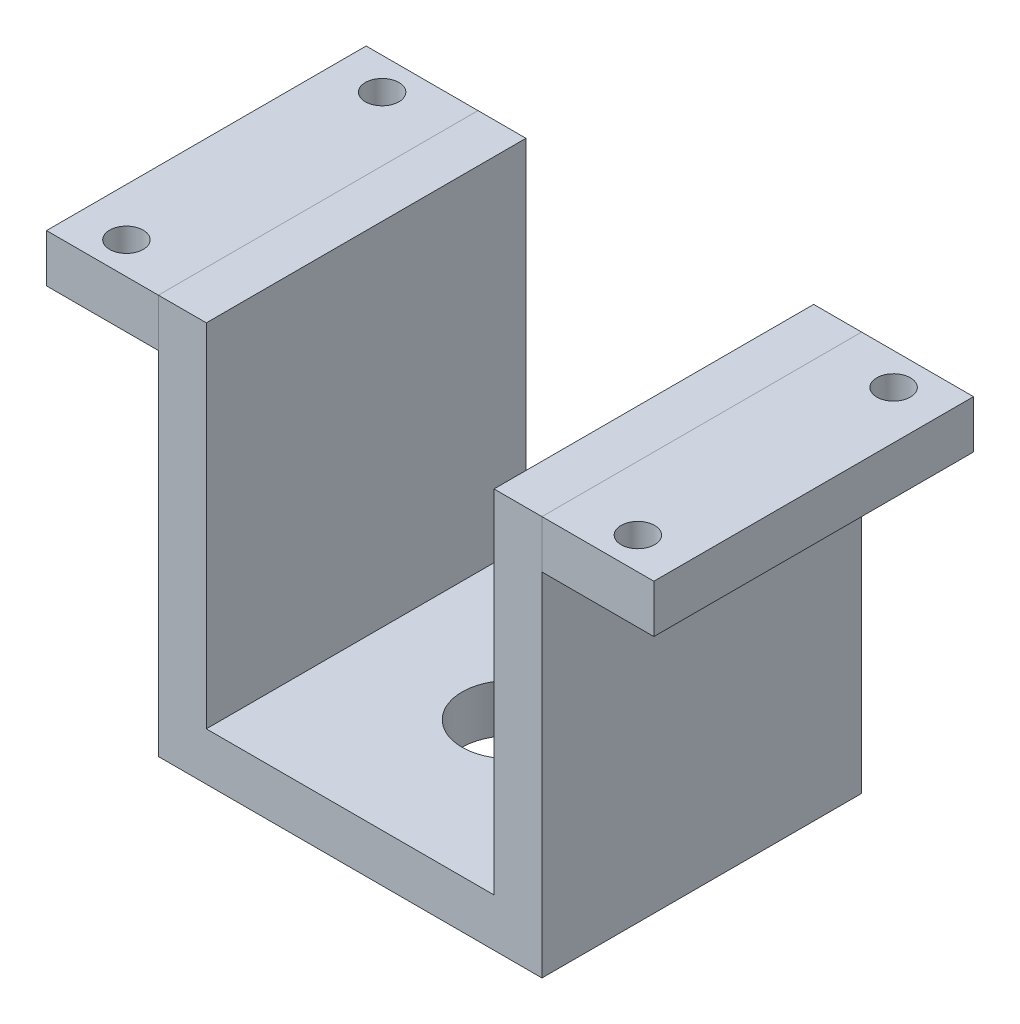
ISO-10303-21;
HEADER;
FILE_DESCRIPTION(('STEP AP214'),'2;1');
FILE_NAME('part.step','',(''),(''),'','','');
FILE_SCHEMA(('AUTOMOTIVE_DESIGN { 1 0 10303 214 1 1 1 1 }'));
ENDSEC;
DATA;
#1=APPLICATION_CONTEXT('core data for automotive mechanical design processes');
#2=APPLICATION_PROTOCOL_DEFINITION('international standard','automotive_design',2000,#1);
#3=PRODUCT_CONTEXT('',#1,'mechanical');
#4=PRODUCT('Part','Part','',(#3));
#5=PRODUCT_RELATED_PRODUCT_CATEGORY('part','',(#4));
#6=PRODUCT_DEFINITION_FORMATION('','',#4);
#7=PRODUCT_DEFINITION_CONTEXT('part definition',#1,'design');
#8=PRODUCT_DEFINITION('design','',#6,#7);
#9=PRODUCT_DEFINITION_SHAPE('','',#8);
#10=(LENGTH_UNIT() NAMED_UNIT(*) SI_UNIT(.MILLI.,.METRE.));
#11=(NAMED_UNIT(*) PLANE_ANGLE_UNIT() SI_UNIT($,.RADIAN.));
#12=(NAMED_UNIT(*) SI_UNIT($,.STERADIAN.) SOLID_ANGLE_UNIT());
#13=UNCERTAINTY_MEASURE_WITH_UNIT(LENGTH_MEASURE(1.E-05),#10,'distance_accuracy_value','');
#14=(GEOMETRIC_REPRESENTATION_CONTEXT(3) GLOBAL_UNCERTAINTY_ASSIGNED_CONTEXT((#13)) GLOBAL_UNIT_ASSIGNED_CONTEXT((#10,
#11,#12)) REPRESENTATION_CONTEXT('',''));
#15=CARTESIAN_POINT('',(0.,0.,0.));
#16=DIRECTION('',(0.,0.,1.));
#17=DIRECTION('',(1.,0.,0.));
#18=AXIS2_PLACEMENT_3D('',#15,#16,#17);
#19=CARTESIAN_POINT('',(11.9999999999999,22.,-10.));
#20=DIRECTION('',(-1.,0.,0.));
#21=DIRECTION('',(0.,0.,1.));
#22=AXIS2_PLACEMENT_3D('',#19,#20,#21);
#23=PLANE('',#22);
#24=DIRECTION('',(0.,0.,1.));
#25=VECTOR('',#24,1.);
#26=CARTESIAN_POINT('',(11.9999999999999,25.,-10.));
#27=LINE('',#26,#25);
#28=CARTESIAN_POINT('',(11.9999999999999,25.,-10.));
#29=VERTEX_POINT('',#28);
#30=CARTESIAN_POINT('',(12.0000000000001,25.,10.));
#31=VERTEX_POINT('',#30);
#32=EDGE_CURVE('E122',#29,#31,#27,.T.);
#33=ORIENTED_EDGE('',*,*,#32,.F.);
#34=DIRECTION('',(0.,1.,0.));
#35=VECTOR('',#34,1.);
#36=CARTESIAN_POINT('',(11.9999999999999,22.,-10.));
#37=LINE('',#36,#35);
#38=CARTESIAN_POINT('',(11.9999999999999,22.,-10.));
#39=VERTEX_POINT('',#38);
#40=EDGE_CURVE('E12',#39,#29,#37,.T.);
#41=ORIENTED_EDGE('',*,*,#40,.F.);
#42=DIRECTION('',(0.,0.,1.));
#43=VECTOR('',#42,1.);
#44=CARTESIAN_POINT('',(11.9999999999999,22.,-10.));
#45=LINE('',#44,#43);
#46=CARTESIAN_POINT('',(12.0000000000001,22.,10.));
#47=VERTEX_POINT('',#46);
#48=EDGE_CURVE('E112',#39,#47,#45,.T.);
#49=ORIENTED_EDGE('',*,*,#48,.T.);
#50=DIRECTION('',(0.,1.,0.));
#51=VECTOR('',#50,1.);
#52=CARTESIAN_POINT('',(12.0000000000001,22.,10.));
#53=LINE('',#52,#51);
#54=EDGE_CURVE('E53',#47,#31,#53,.T.);
#55=ORIENTED_EDGE('',*,*,#54,.T.);
#56=EDGE_LOOP('',(#33,#41,#49,#55));
#57=FACE_BOUND('',#56,.T.);
#58=ADVANCED_FACE('F50',(#57),#23,.T.);
#59=CARTESIAN_POINT('',(11.9999999999999,22.,-10.));
#60=DIRECTION('',(0.,0.,-1.));
#61=DIRECTION('',(-1.,0.,0.));
#62=AXIS2_PLACEMENT_3D('',#59,#60,#61);
#63=PLANE('',#62);
#64=DIRECTION('',(-1.,0.,0.));
#65=VECTOR('',#64,1.);
#66=CARTESIAN_POINT('',(11.9999999999999,25.,-10.));
#67=LINE('',#66,#65);
#68=CARTESIAN_POINT('',(19.,25.,-10.));
#69=VERTEX_POINT('',#68);
#70=EDGE_CURVE('E116',#69,#29,#67,.T.);
#71=ORIENTED_EDGE('',*,*,#70,.F.);
#72=DIRECTION('',(0.,1.,0.));
#73=VECTOR('',#72,1.);
#74=CARTESIAN_POINT('',(19.,22.,-10.));
#75=LINE('',#74,#73);
#76=CARTESIAN_POINT('',(19.,22.,-10.));
#77=VERTEX_POINT('',#76);
#78=EDGE_CURVE('E60',#77,#69,#75,.T.);
#79=ORIENTED_EDGE('',*,*,#78,.F.);
#80=DIRECTION('',(-1.,0.,0.));
#81=VECTOR('',#80,1.);
#82=CARTESIAN_POINT('',(11.9999999999999,22.,-10.));
#83=LINE('',#82,#81);
#84=EDGE_CURVE('E107',#77,#39,#83,.T.);
#85=ORIENTED_EDGE('',*,*,#84,.T.);
#86=ORIENTED_EDGE('',*,*,#40,.T.);
#87=EDGE_LOOP('',(#71,#79,#85,#86));
#88=FACE_BOUND('',#87,.T.);
#89=ADVANCED_FACE('F139',(#88),#63,.T.);
#90=CARTESIAN_POINT('',(19.,22.,-10.));
#91=DIRECTION('',(1.,0.,0.));
#92=DIRECTION('',(0.,0.,-1.));
#93=AXIS2_PLACEMENT_3D('',#90,#91,#92);
#94=PLANE('',#93);
#95=DIRECTION('',(0.,0.,-1.));
#96=VECTOR('',#95,1.);
#97=CARTESIAN_POINT('',(19.,25.,-10.));
#98=LINE('',#97,#96);
#99=CARTESIAN_POINT('',(19.,25.,10.));
#100=VERTEX_POINT('',#99);
#101=EDGE_CURVE('E101',#100,#69,#98,.T.);
#102=ORIENTED_EDGE('',*,*,#101,.F.);
#103=DIRECTION('',(0.,1.,0.));
#104=VECTOR('',#103,1.);
#105=CARTESIAN_POINT('',(19.,22.,10.));
#106=LINE('',#105,#104);
#107=CARTESIAN_POINT('',(19.,22.,10.));
#108=VERTEX_POINT('',#107);
#109=EDGE_CURVE('E96',#108,#100,#106,.T.);
#110=ORIENTED_EDGE('',*,*,#109,.F.);
#111=DIRECTION('',(0.,0.,-1.));
#112=VECTOR('',#111,1.);
#113=CARTESIAN_POINT('',(19.,22.,-10.));
#114=LINE('',#113,#112);
#115=EDGE_CURVE('E99',#108,#77,#114,.T.);
#116=ORIENTED_EDGE('',*,*,#115,.T.);
#117=ORIENTED_EDGE('',*,*,#78,.T.);
#118=EDGE_LOOP('',(#102,#110,#116,#117));
#119=FACE_BOUND('',#118,.T.);
#120=ADVANCED_FACE('F98',(#119),#94,.T.);
#121=CARTESIAN_POINT('',(12.0000000000001,22.,10.));
#122=DIRECTION('',(0.,0.,1.));
#123=DIRECTION('',(1.,0.,0.));
#124=AXIS2_PLACEMENT_3D('',#121,#122,#123);
#125=PLANE('',#124);
#126=DIRECTION('',(1.,0.,0.));
#127=VECTOR('',#126,1.);
#128=CARTESIAN_POINT('',(12.0000000000001,25.,10.));
#129=LINE('',#128,#127);
#130=EDGE_CURVE('E126',#31,#100,#129,.T.);
#131=ORIENTED_EDGE('',*,*,#130,.F.);
#132=ORIENTED_EDGE('',*,*,#54,.F.);
#133=DIRECTION('',(1.,0.,0.));
#134=VECTOR('',#133,1.);
#135=CARTESIAN_POINT('',(12.0000000000001,22.,10.));
#136=LINE('',#135,#134);
#137=EDGE_CURVE('E106',#47,#108,#136,.T.);
#138=ORIENTED_EDGE('',*,*,#137,.T.);
#139=ORIENTED_EDGE('',*,*,#109,.T.);
#140=EDGE_LOOP('',(#131,#132,#138,#139));
#141=FACE_BOUND('',#140,.T.);
#142=ADVANCED_FACE('F110',(#141),#125,.T.);
#143=CARTESIAN_POINT('',(0.,22.,0.));
#144=DIRECTION('',(0.,1.,0.));
#145=DIRECTION('',(0.,0.,1.));
#146=AXIS2_PLACEMENT_3D('',#143,#144,#145);
#147=PLANE('',#146);
#148=CARTESIAN_POINT('',(15.9999999999999,22.,8.00000000000001));
#149=DIRECTION('',(0.,1.,0.));
#150=DIRECTION('',(0.,0.,1.));
#151=AXIS2_PLACEMENT_3D('',#148,#149,#150);
#152=CIRCLE('',#151,1.05);
#153=CARTESIAN_POINT('',(15.9999999999999,22.,9.05000000000001));
#154=VERTEX_POINT('',#153);
#155=EDGE_CURVE('E172',#154,#154,#152,.T.);
#156=ORIENTED_EDGE('',*,*,#155,.T.);
#157=EDGE_LOOP('',(#156));
#158=FACE_BOUND('',#157,.T.);
#159=CARTESIAN_POINT('',(15.9999999999999,22.,-8.00000000000001));
#160=DIRECTION('',(0.,1.,0.));
#161=DIRECTION('',(0.,0.,-1.));
#162=AXIS2_PLACEMENT_3D('',#159,#160,#161);
#163=CIRCLE('',#162,1.05);
#164=CARTESIAN_POINT('',(15.9999999999999,22.,-9.05000000000001));
#165=VERTEX_POINT('',#164);
#166=EDGE_CURVE('E127',#165,#165,#163,.T.);
#167=ORIENTED_EDGE('',*,*,#166,.T.);
#168=EDGE_LOOP('',(#167));
#169=FACE_BOUND('',#168,.T.);
#170=ORIENTED_EDGE('',*,*,#48,.F.);
#171=ORIENTED_EDGE('',*,*,#84,.F.);
#172=ORIENTED_EDGE('',*,*,#115,.F.);
#173=ORIENTED_EDGE('',*,*,#137,.F.);
#174=EDGE_LOOP('',(#170,#171,#172,#173));
#175=FACE_BOUND('',#174,.T.);
#176=ADVANCED_FACE('F105',(#158,#169,#175),#147,.F.);
#177=CARTESIAN_POINT('',(0.,25.,0.));
#178=DIRECTION('',(0.,1.,0.));
#179=DIRECTION('',(0.,0.,1.));
#180=AXIS2_PLACEMENT_3D('',#177,#178,#179);
#181=PLANE('',#180);
#182=CARTESIAN_POINT('',(15.9999999999999,25.,8.00000000000001));
#183=DIRECTION('',(0.,1.,0.));
#184=DIRECTION('',(0.,0.,1.));
#185=AXIS2_PLACEMENT_3D('',#182,#183,#184);
#186=CIRCLE('',#185,1.05);
#187=CARTESIAN_POINT('',(15.9999999999999,25.,9.05000000000001));
#188=VERTEX_POINT('',#187);
#189=EDGE_CURVE('E175',#188,#188,#186,.T.);
#190=ORIENTED_EDGE('',*,*,#189,.F.);
#191=EDGE_LOOP('',(#190));
#192=FACE_BOUND('',#191,.T.);
#193=CARTESIAN_POINT('',(15.9999999999999,25.,-8.00000000000001));
#194=DIRECTION('',(0.,1.,0.));
#195=DIRECTION('',(0.,0.,-1.));
#196=AXIS2_PLACEMENT_3D('',#193,#194,#195);
#197=CIRCLE('',#196,1.05);
#198=CARTESIAN_POINT('',(15.9999999999999,25.,-9.05000000000001));
#199=VERTEX_POINT('',#198);
#200=EDGE_CURVE('E177',#199,#199,#197,.T.);
#201=ORIENTED_EDGE('',*,*,#200,.F.);
#202=EDGE_LOOP('',(#201));
#203=FACE_BOUND('',#202,.T.);
#204=ORIENTED_EDGE('',*,*,#32,.T.);
#205=ORIENTED_EDGE('',*,*,#130,.T.);
#206=ORIENTED_EDGE('',*,*,#101,.T.);
#207=ORIENTED_EDGE('',*,*,#70,.T.);
#208=EDGE_LOOP('',(#204,#205,#206,#207));
#209=FACE_BOUND('',#208,.T.);
#210=ADVANCED_FACE('F138',(#192,#203,#209),#181,.T.);
#211=CARTESIAN_POINT('',(15.9999999999999,22.,-8.00000000000001));
#212=DIRECTION('',(0.,1.,0.));
#213=DIRECTION('',(0.,0.,1.));
#214=AXIS2_PLACEMENT_3D('',#211,#212,#213);
#215=CYLINDRICAL_SURFACE('',#214,1.05);
#216=ORIENTED_EDGE('',*,*,#166,.F.);
#217=EDGE_LOOP('',(#216));
#218=FACE_BOUND('',#217,.T.);
#219=ORIENTED_EDGE('',*,*,#200,.T.);
#220=EDGE_LOOP('',(#219));
#221=FACE_BOUND('',#220,.T.);
#222=ADVANCED_FACE('F157',(#218,#221),#215,.F.);
#223=CARTESIAN_POINT('',(15.9999999999999,22.,8.00000000000001));
#224=DIRECTION('',(0.,1.,0.));
#225=DIRECTION('',(0.,0.,1.));
#226=AXIS2_PLACEMENT_3D('',#223,#224,#225);
#227=CYLINDRICAL_SURFACE('',#226,1.05);
#228=ORIENTED_EDGE('',*,*,#155,.F.);
#229=EDGE_LOOP('',(#228));
#230=FACE_BOUND('',#229,.T.);
#231=ORIENTED_EDGE('',*,*,#189,.T.);
#232=EDGE_LOOP('',(#231));
#233=FACE_BOUND('',#232,.T.);
#234=ADVANCED_FACE('F164',(#230,#233),#227,.F.);
#235=CLOSED_SHELL('',(#58,#89,#120,#142,#176,#210,#222,#234));
#236=MANIFOLD_SOLID_BREP('B2',#235);
#237=CARTESIAN_POINT('',(-12.,22.,-10.));
#238=DIRECTION('',(1.,0.,0.));
#239=DIRECTION('',(0.,0.,-1.));
#240=AXIS2_PLACEMENT_3D('',#237,#238,#239);
#241=PLANE('',#240);
#242=DIRECTION('',(0.,0.,-1.));
#243=VECTOR('',#242,1.);
#244=CARTESIAN_POINT('',(-12.,25.,-10.));
#245=LINE('',#244,#243);
#246=CARTESIAN_POINT('',(-12.,25.,10.));
#247=VERTEX_POINT('',#246);
#248=CARTESIAN_POINT('',(-12.,25.,-10.));
#249=VERTEX_POINT('',#248);
#250=EDGE_CURVE('E321',#247,#249,#245,.T.);
#251=ORIENTED_EDGE('',*,*,#250,.F.);
#252=DIRECTION('',(0.,1.,0.));
#253=VECTOR('',#252,1.);
#254=CARTESIAN_POINT('',(-12.,22.,10.));
#255=LINE('',#254,#253);
#256=CARTESIAN_POINT('',(-12.,22.,10.));
#257=VERTEX_POINT('',#256);
#258=EDGE_CURVE('E48',#257,#247,#255,.T.);
#259=ORIENTED_EDGE('',*,*,#258,.F.);
#260=DIRECTION('',(0.,0.,-1.));
#261=VECTOR('',#260,1.);
#262=CARTESIAN_POINT('',(-12.,22.,-10.));
#263=LINE('',#262,#261);
#264=CARTESIAN_POINT('',(-12.,22.,-10.));
#265=VERTEX_POINT('',#264);
#266=EDGE_CURVE('E311',#257,#265,#263,.T.);
#267=ORIENTED_EDGE('',*,*,#266,.T.);
#268=DIRECTION('',(0.,1.,0.));
#269=VECTOR('',#268,1.);
#270=CARTESIAN_POINT('',(-12.,22.,-10.));
#271=LINE('',#270,#269);
#272=EDGE_CURVE('E252',#265,#249,#271,.T.);
#273=ORIENTED_EDGE('',*,*,#272,.T.);
#274=EDGE_LOOP('',(#251,#259,#267,#273));
#275=FACE_BOUND('',#274,.T.);
#276=ADVANCED_FACE('F249',(#275),#241,.T.);
#277=CARTESIAN_POINT('',(-12.,22.,10.));
#278=DIRECTION('',(0.,0.,1.));
#279=DIRECTION('',(1.,0.,0.));
#280=AXIS2_PLACEMENT_3D('',#277,#278,#279);
#281=PLANE('',#280);
#282=DIRECTION('',(1.,0.,0.));
#283=VECTOR('',#282,1.);
#284=CARTESIAN_POINT('',(-12.,25.,10.));
#285=LINE('',#284,#283);
#286=CARTESIAN_POINT('',(-19.,25.,10.));
#287=VERTEX_POINT('',#286);
#288=EDGE_CURVE('E316',#287,#247,#285,.T.);
#289=ORIENTED_EDGE('',*,*,#288,.F.);
#290=DIRECTION('',(0.,1.,0.));
#291=VECTOR('',#290,1.);
#292=CARTESIAN_POINT('',(-19.,22.,10.));
#293=LINE('',#292,#291);
#294=CARTESIAN_POINT('',(-19.,22.,10.));
#295=VERTEX_POINT('',#294);
#296=EDGE_CURVE('E259',#295,#287,#293,.T.);
#297=ORIENTED_EDGE('',*,*,#296,.F.);
#298=DIRECTION('',(1.,0.,0.));
#299=VECTOR('',#298,1.);
#300=CARTESIAN_POINT('',(-12.,22.,10.));
#301=LINE('',#300,#299);
#302=EDGE_CURVE('E306',#295,#257,#301,.T.);
#303=ORIENTED_EDGE('',*,*,#302,.T.);
#304=ORIENTED_EDGE('',*,*,#258,.T.);
#305=EDGE_LOOP('',(#289,#297,#303,#304));
#306=FACE_BOUND('',#305,.T.);
#307=ADVANCED_FACE('F351',(#306),#281,.T.);
#308=CARTESIAN_POINT('',(-19.,22.,-10.));
#309=DIRECTION('',(-1.,0.,0.));
#310=DIRECTION('',(0.,0.,1.));
#311=AXIS2_PLACEMENT_3D('',#308,#309,#310);
#312=PLANE('',#311);
#313=DIRECTION('',(0.,0.,1.));
#314=VECTOR('',#313,1.);
#315=CARTESIAN_POINT('',(-19.,25.,-10.));
#316=LINE('',#315,#314);
#317=CARTESIAN_POINT('',(-19.,25.,-10.));
#318=VERTEX_POINT('',#317);
#319=EDGE_CURVE('E300',#318,#287,#316,.T.);
#320=ORIENTED_EDGE('',*,*,#319,.F.);
#321=DIRECTION('',(0.,1.,0.));
#322=VECTOR('',#321,1.);
#323=CARTESIAN_POINT('',(-19.,22.,-10.));
#324=LINE('',#323,#322);
#325=CARTESIAN_POINT('',(-19.,22.,-10.));
#326=VERTEX_POINT('',#325);
#327=EDGE_CURVE('E295',#326,#318,#324,.T.);
#328=ORIENTED_EDGE('',*,*,#327,.F.);
#329=DIRECTION('',(0.,0.,1.));
#330=VECTOR('',#329,1.);
#331=CARTESIAN_POINT('',(-19.,22.,-10.));
#332=LINE('',#331,#330);
#333=EDGE_CURVE('E298',#326,#295,#332,.T.);
#334=ORIENTED_EDGE('',*,*,#333,.T.);
#335=ORIENTED_EDGE('',*,*,#296,.T.);
#336=EDGE_LOOP('',(#320,#328,#334,#335));
#337=FACE_BOUND('',#336,.T.);
#338=ADVANCED_FACE('F297',(#337),#312,.T.);
#339=CARTESIAN_POINT('',(-12.,22.,-10.));
#340=DIRECTION('',(0.,0.,-1.));
#341=DIRECTION('',(-1.,0.,0.));
#342=AXIS2_PLACEMENT_3D('',#339,#340,#341);
#343=PLANE('',#342);
#344=DIRECTION('',(-1.,0.,0.));
#345=VECTOR('',#344,1.);
#346=CARTESIAN_POINT('',(-12.,25.,-10.));
#347=LINE('',#346,#345);
#348=EDGE_CURVE('E325',#249,#318,#347,.T.);
#349=ORIENTED_EDGE('',*,*,#348,.F.);
#350=ORIENTED_EDGE('',*,*,#272,.F.);
#351=DIRECTION('',(-1.,0.,0.));
#352=VECTOR('',#351,1.);
#353=CARTESIAN_POINT('',(-12.,22.,-10.));
#354=LINE('',#353,#352);
#355=EDGE_CURVE('E305',#265,#326,#354,.T.);
#356=ORIENTED_EDGE('',*,*,#355,.T.);
#357=ORIENTED_EDGE('',*,*,#327,.T.);
#358=EDGE_LOOP('',(#349,#350,#356,#357));
#359=FACE_BOUND('',#358,.T.);
#360=ADVANCED_FACE('F309',(#359),#343,.T.);
#361=CARTESIAN_POINT('',(0.,22.,0.));
#362=DIRECTION('',(0.,-1.,0.));
#363=DIRECTION('',(0.,0.,-1.));
#364=AXIS2_PLACEMENT_3D('',#361,#362,#363);
#365=PLANE('',#364);
#366=CARTESIAN_POINT('',(-16.,22.,8.00000000000001));
#367=DIRECTION('',(0.,1.,0.));
#368=DIRECTION('',(0.,0.,-1.));
#369=AXIS2_PLACEMENT_3D('',#366,#367,#368);
#370=CIRCLE('',#369,1.05);
#371=CARTESIAN_POINT('',(-16.,22.,6.95000000000001));
#372=VERTEX_POINT('',#371);
#373=EDGE_CURVE('E335',#372,#372,#370,.T.);
#374=ORIENTED_EDGE('',*,*,#373,.T.);
#375=EDGE_LOOP('',(#374));
#376=FACE_BOUND('',#375,.T.);
#377=CARTESIAN_POINT('',(-16.,22.,-8.00000000000001));
#378=DIRECTION('',(0.,1.,0.));
#379=DIRECTION('',(0.,0.,1.));
#380=AXIS2_PLACEMENT_3D('',#377,#378,#379);
#381=CIRCLE('',#380,1.05);
#382=CARTESIAN_POINT('',(-16.,22.,-6.95000000000001));
#383=VERTEX_POINT('',#382);
#384=EDGE_CURVE('E326',#383,#383,#381,.T.);
#385=ORIENTED_EDGE('',*,*,#384,.T.);
#386=EDGE_LOOP('',(#385));
#387=FACE_BOUND('',#386,.T.);
#388=ORIENTED_EDGE('',*,*,#266,.F.);
#389=ORIENTED_EDGE('',*,*,#302,.F.);
#390=ORIENTED_EDGE('',*,*,#333,.F.);
#391=ORIENTED_EDGE('',*,*,#355,.F.);
#392=EDGE_LOOP('',(#388,#389,#390,#391));
#393=FACE_BOUND('',#392,.T.);
#394=ADVANCED_FACE('F304',(#376,#387,#393),#365,.T.);
#395=CARTESIAN_POINT('',(0.,25.,0.));
#396=DIRECTION('',(0.,-1.,0.));
#397=DIRECTION('',(0.,0.,-1.));
#398=AXIS2_PLACEMENT_3D('',#395,#396,#397);
#399=PLANE('',#398);
#400=CARTESIAN_POINT('',(-16.,25.,8.00000000000001));
#401=DIRECTION('',(0.,1.,0.));
#402=DIRECTION('',(0.,0.,-1.));
#403=AXIS2_PLACEMENT_3D('',#400,#401,#402);
#404=CIRCLE('',#403,1.05);
#405=CARTESIAN_POINT('',(-16.,25.,6.95000000000001));
#406=VERTEX_POINT('',#405);
#407=EDGE_CURVE('E339',#406,#406,#404,.T.);
#408=ORIENTED_EDGE('',*,*,#407,.F.);
#409=EDGE_LOOP('',(#408));
#410=FACE_BOUND('',#409,.T.);
#411=CARTESIAN_POINT('',(-16.,25.,-8.00000000000001));
#412=DIRECTION('',(0.,1.,0.));
#413=DIRECTION('',(0.,0.,1.));
#414=AXIS2_PLACEMENT_3D('',#411,#412,#413);
#415=CIRCLE('',#414,1.05);
#416=CARTESIAN_POINT('',(-16.,25.,-6.95000000000001));
#417=VERTEX_POINT('',#416);
#418=EDGE_CURVE('E338',#417,#417,#415,.T.);
#419=ORIENTED_EDGE('',*,*,#418,.F.);
#420=EDGE_LOOP('',(#419));
#421=FACE_BOUND('',#420,.T.);
#422=ORIENTED_EDGE('',*,*,#250,.T.);
#423=ORIENTED_EDGE('',*,*,#348,.T.);
#424=ORIENTED_EDGE('',*,*,#319,.T.);
#425=ORIENTED_EDGE('',*,*,#288,.T.);
#426=EDGE_LOOP('',(#422,#423,#424,#425));
#427=FACE_BOUND('',#426,.T.);
#428=ADVANCED_FACE('F350',(#410,#421,#427),#399,.F.);
#429=CARTESIAN_POINT('',(-16.,22.,-8.00000000000001));
#430=DIRECTION('',(0.,1.,0.));
#431=DIRECTION('',(0.,0.,1.));
#432=AXIS2_PLACEMENT_3D('',#429,#430,#431);
#433=CYLINDRICAL_SURFACE('',#432,1.05);
#434=ORIENTED_EDGE('',*,*,#384,.F.);
#435=EDGE_LOOP('',(#434));
#436=FACE_BOUND('',#435,.T.);
#437=ORIENTED_EDGE('',*,*,#418,.T.);
#438=EDGE_LOOP('',(#437));
#439=FACE_BOUND('',#438,.T.);
#440=ADVANCED_FACE('F369',(#436,#439),#433,.F.);
#441=CARTESIAN_POINT('',(-16.,22.,8.00000000000001));
#442=DIRECTION('',(0.,1.,0.));
#443=DIRECTION('',(0.,0.,1.));
#444=AXIS2_PLACEMENT_3D('',#441,#442,#443);
#445=CYLINDRICAL_SURFACE('',#444,1.05);
#446=ORIENTED_EDGE('',*,*,#373,.F.);
#447=EDGE_LOOP('',(#446));
#448=FACE_BOUND('',#447,.T.);
#449=ORIENTED_EDGE('',*,*,#407,.T.);
#450=EDGE_LOOP('',(#449));
#451=FACE_BOUND('',#450,.T.);
#452=ADVANCED_FACE('F375',(#448,#451),#445,.F.);
#453=CLOSED_SHELL('',(#276,#307,#338,#360,#394,#428,#440,#452));
#454=MANIFOLD_SOLID_BREP('B6',#453);
#455=CARTESIAN_POINT('',(0.,3.,-10.));
#456=DIRECTION('',(0.,0.,-1.));
#457=DIRECTION('',(-1.,0.,0.));
#458=AXIS2_PLACEMENT_3D('',#455,#456,#457);
#459=PLANE('',#458);
#460=DIRECTION('',(1.,0.,0.));
#461=VECTOR('',#460,1.);
#462=CARTESIAN_POINT('',(0.,0.,-10.));
#463=LINE('',#462,#461);
#464=CARTESIAN_POINT('',(-12.,0.,-10.));
#465=VERTEX_POINT('',#464);
#466=CARTESIAN_POINT('',(12.,0.,-10.));
#467=VERTEX_POINT('',#466);
#468=EDGE_CURVE('E597',#465,#467,#463,.T.);
#469=ORIENTED_EDGE('',*,*,#468,.F.);
#470=DIRECTION('',(0.,-1.,0.));
#471=VECTOR('',#470,1.);
#472=CARTESIAN_POINT('',(-12.,25.,-10.));
#473=LINE('',#472,#471);
#474=CARTESIAN_POINT('',(-12.,25.,-10.));
#475=VERTEX_POINT('',#474);
#476=EDGE_CURVE('E576',#475,#465,#473,.T.);
#477=ORIENTED_EDGE('',*,*,#476,.F.);
#478=DIRECTION('',(1.,0.,0.));
#479=VECTOR('',#478,1.);
#480=CARTESIAN_POINT('',(0.,25.,-10.));
#481=LINE('',#480,#479);
#482=CARTESIAN_POINT('',(-8.99999999999999,25.,-10.));
#483=VERTEX_POINT('',#482);
#484=EDGE_CURVE('E557',#475,#483,#481,.T.);
#485=ORIENTED_EDGE('',*,*,#484,.T.);
#486=DIRECTION('',(0.,-1.,0.));
#487=VECTOR('',#486,1.);
#488=CARTESIAN_POINT('',(-8.99999999999999,25.,-10.));
#489=LINE('',#488,#487);
#490=CARTESIAN_POINT('',(-8.99999999999999,3.,-10.));
#491=VERTEX_POINT('',#490);
#492=EDGE_CURVE('E580',#483,#491,#489,.T.);
#493=ORIENTED_EDGE('',*,*,#492,.T.);
#494=DIRECTION('',(1.,0.,0.));
#495=VECTOR('',#494,1.);
#496=CARTESIAN_POINT('',(0.,3.,-10.));
#497=LINE('',#496,#495);
#498=CARTESIAN_POINT('',(9.00000000000001,3.,-10.));
#499=VERTEX_POINT('',#498);
#500=EDGE_CURVE('E514',#491,#499,#497,.T.);
#501=ORIENTED_EDGE('',*,*,#500,.T.);
#502=DIRECTION('',(0.,-1.,0.));
#503=VECTOR('',#502,1.);
#504=CARTESIAN_POINT('',(9.00000000000001,25.,-10.));
#505=LINE('',#504,#503);
#506=CARTESIAN_POINT('',(9.00000000000001,25.,-10.));
#507=VERTEX_POINT('',#506);
#508=EDGE_CURVE('E508',#507,#499,#505,.T.);
#509=ORIENTED_EDGE('',*,*,#508,.F.);
#510=DIRECTION('',(1.,0.,0.));
#511=VECTOR('',#510,1.);
#512=CARTESIAN_POINT('',(0.,25.,-10.));
#513=LINE('',#512,#511);
#514=CARTESIAN_POINT('',(12.,25.,-10.));
#515=VERTEX_POINT('',#514);
#516=EDGE_CURVE('E512',#507,#515,#513,.T.);
#517=ORIENTED_EDGE('',*,*,#516,.T.);
#518=DIRECTION('',(0.,-1.,0.));
#519=VECTOR('',#518,1.);
#520=CARTESIAN_POINT('',(12.,25.,-10.));
#521=LINE('',#520,#519);
#522=EDGE_CURVE('E544',#515,#467,#521,.T.);
#523=ORIENTED_EDGE('',*,*,#522,.T.);
#524=EDGE_LOOP('',(#469,#477,#485,#493,#501,#509,#517,#523));
#525=FACE_BOUND('',#524,.T.);
#526=ADVANCED_FACE('F439',(#525),#459,.T.);
#527=CARTESIAN_POINT('',(0.,3.,0.));
#528=DIRECTION('',(0.,-1.,0.));
#529=DIRECTION('',(0.,0.,-1.));
#530=AXIS2_PLACEMENT_3D('',#527,#528,#529);
#531=CYLINDRICAL_SURFACE('',#530,3.);
#532=CARTESIAN_POINT('',(0.,3.,0.));
#533=DIRECTION('',(0.,1.,0.));
#534=DIRECTION('',(0.,0.,1.));
#535=AXIS2_PLACEMENT_3D('',#532,#533,#534);
#536=CIRCLE('',#535,3.);
#537=CARTESIAN_POINT('',(0.,3.,3.));
#538=VERTEX_POINT('',#537);
#539=EDGE_CURVE('E584',#538,#538,#536,.T.);
#540=ORIENTED_EDGE('',*,*,#539,.T.);
#541=EDGE_LOOP('',(#540));
#542=FACE_BOUND('',#541,.T.);
#543=CARTESIAN_POINT('',(0.,0.,0.));
#544=DIRECTION('',(0.,1.,0.));
#545=DIRECTION('',(0.,0.,1.));
#546=AXIS2_PLACEMENT_3D('',#543,#544,#545);
#547=CIRCLE('',#546,3.);
#548=CARTESIAN_POINT('',(0.,0.,3.));
#549=VERTEX_POINT('',#548);
#550=EDGE_CURVE('E583',#549,#549,#547,.T.);
#551=ORIENTED_EDGE('',*,*,#550,.F.);
#552=EDGE_LOOP('',(#551));
#553=FACE_BOUND('',#552,.T.);
#554=ADVANCED_FACE('F441',(#542,#553),#531,.F.);
#555=CARTESIAN_POINT('',(0.,3.,10.));
#556=DIRECTION('',(0.,0.,-1.));
#557=DIRECTION('',(-1.,0.,0.));
#558=AXIS2_PLACEMENT_3D('',#555,#556,#557);
#559=PLANE('',#558);
#560=DIRECTION('',(1.,0.,0.));
#561=VECTOR('',#560,1.);
#562=CARTESIAN_POINT('',(0.,0.,10.));
#563=LINE('',#562,#561);
#564=CARTESIAN_POINT('',(-12.,0.,10.));
#565=VERTEX_POINT('',#564);
#566=CARTESIAN_POINT('',(12.,0.,10.));
#567=VERTEX_POINT('',#566);
#568=EDGE_CURVE('E443',#565,#567,#563,.T.);
#569=ORIENTED_EDGE('',*,*,#568,.T.);
#570=DIRECTION('',(0.,-1.,0.));
#571=VECTOR('',#570,1.);
#572=CARTESIAN_POINT('',(12.,25.,10.));
#573=LINE('',#572,#571);
#574=CARTESIAN_POINT('',(12.,25.,10.));
#575=VERTEX_POINT('',#574);
#576=EDGE_CURVE('E548',#575,#567,#573,.T.);
#577=ORIENTED_EDGE('',*,*,#576,.F.);
#578=DIRECTION('',(1.,0.,0.));
#579=VECTOR('',#578,1.);
#580=CARTESIAN_POINT('',(0.,25.,10.));
#581=LINE('',#580,#579);
#582=CARTESIAN_POINT('',(9.00000000000001,25.,10.));
#583=VERTEX_POINT('',#582);
#584=EDGE_CURVE('E527',#583,#575,#581,.T.);
#585=ORIENTED_EDGE('',*,*,#584,.F.);
#586=DIRECTION('',(0.,-1.,0.));
#587=VECTOR('',#586,1.);
#588=CARTESIAN_POINT('',(9.00000000000001,25.,10.));
#589=LINE('',#588,#587);
#590=CARTESIAN_POINT('',(9.00000000000001,3.,10.));
#591=VERTEX_POINT('',#590);
#592=EDGE_CURVE('E518',#583,#591,#589,.T.);
#593=ORIENTED_EDGE('',*,*,#592,.T.);
#594=DIRECTION('',(1.,0.,0.));
#595=VECTOR('',#594,1.);
#596=CARTESIAN_POINT('',(0.,3.,10.));
#597=LINE('',#596,#595);
#598=CARTESIAN_POINT('',(-8.99999999999999,3.,10.));
#599=VERTEX_POINT('',#598);
#600=EDGE_CURVE('E247',#599,#591,#597,.T.);
#601=ORIENTED_EDGE('',*,*,#600,.F.);
#602=DIRECTION('',(0.,-1.,0.));
#603=VECTOR('',#602,1.);
#604=CARTESIAN_POINT('',(-8.99999999999999,25.,10.));
#605=LINE('',#604,#603);
#606=CARTESIAN_POINT('',(-8.99999999999999,25.,10.));
#607=VERTEX_POINT('',#606);
#608=EDGE_CURVE('E457',#607,#599,#605,.T.);
#609=ORIENTED_EDGE('',*,*,#608,.F.);
#610=DIRECTION('',(1.,0.,0.));
#611=VECTOR('',#610,1.);
#612=CARTESIAN_POINT('',(0.,25.,10.));
#613=LINE('',#612,#611);
#614=CARTESIAN_POINT('',(-12.,25.,10.));
#615=VERTEX_POINT('',#614);
#616=EDGE_CURVE('E565',#615,#607,#613,.T.);
#617=ORIENTED_EDGE('',*,*,#616,.F.);
#618=DIRECTION('',(0.,-1.,0.));
#619=VECTOR('',#618,1.);
#620=CARTESIAN_POINT('',(-12.,25.,10.));
#621=LINE('',#620,#619);
#622=EDGE_CURVE('E572',#615,#565,#621,.T.);
#623=ORIENTED_EDGE('',*,*,#622,.T.);
#624=EDGE_LOOP('',(#569,#577,#585,#593,#601,#609,#617,#623));
#625=FACE_BOUND('',#624,.T.);
#626=ADVANCED_FACE('F604',(#625),#559,.F.);
#627=CARTESIAN_POINT('',(0.,3.,0.));
#628=DIRECTION('',(0.,1.,0.));
#629=DIRECTION('',(0.,0.,1.));
#630=AXIS2_PLACEMENT_3D('',#627,#628,#629);
#631=PLANE('',#630);
#632=ORIENTED_EDGE('',*,*,#539,.F.);
#633=EDGE_LOOP('',(#632));
#634=FACE_BOUND('',#633,.T.);
#635=DIRECTION('',(0.,0.,1.));
#636=VECTOR('',#635,1.);
#637=CARTESIAN_POINT('',(9.00000000000001,3.,0.));
#638=LINE('',#637,#636);
#639=EDGE_CURVE('E464',#499,#591,#638,.T.);
#640=ORIENTED_EDGE('',*,*,#639,.F.);
#641=ORIENTED_EDGE('',*,*,#500,.F.);
#642=DIRECTION('',(0.,0.,1.));
#643=VECTOR('',#642,1.);
#644=CARTESIAN_POINT('',(-8.99999999999999,3.,0.));
#645=LINE('',#644,#643);
#646=EDGE_CURVE('E449',#491,#599,#645,.T.);
#647=ORIENTED_EDGE('',*,*,#646,.T.);
#648=ORIENTED_EDGE('',*,*,#600,.T.);
#649=EDGE_LOOP('',(#640,#641,#647,#648));
#650=FACE_BOUND('',#649,.T.);
#651=ADVANCED_FACE('F612',(#634,#650),#631,.T.);
#652=CARTESIAN_POINT('',(0.,0.,0.));
#653=DIRECTION('',(0.,1.,0.));
#654=DIRECTION('',(0.,0.,1.));
#655=AXIS2_PLACEMENT_3D('',#652,#653,#654);
#656=PLANE('',#655);
#657=ORIENTED_EDGE('',*,*,#550,.T.);
#658=EDGE_LOOP('',(#657));
#659=FACE_BOUND('',#658,.T.);
#660=ORIENTED_EDGE('',*,*,#468,.T.);
#661=DIRECTION('',(0.,0.,-1.));
#662=VECTOR('',#661,1.);
#663=CARTESIAN_POINT('',(12.,0.,0.));
#664=LINE('',#663,#662);
#665=EDGE_CURVE('E534',#567,#467,#664,.T.);
#666=ORIENTED_EDGE('',*,*,#665,.F.);
#667=ORIENTED_EDGE('',*,*,#568,.F.);
#668=DIRECTION('',(0.,0.,-1.));
#669=VECTOR('',#668,1.);
#670=CARTESIAN_POINT('',(-12.,0.,0.));
#671=LINE('',#670,#669);
#672=EDGE_CURVE('E517',#565,#465,#671,.T.);
#673=ORIENTED_EDGE('',*,*,#672,.T.);
#674=EDGE_LOOP('',(#660,#666,#667,#673));
#675=FACE_BOUND('',#674,.T.);
#676=ADVANCED_FACE('F609',(#659,#675),#656,.F.);
#677=CARTESIAN_POINT('',(-8.99999999999999,25.,0.));
#678=DIRECTION('',(1.,0.,0.));
#679=DIRECTION('',(0.,0.,-1.));
#680=AXIS2_PLACEMENT_3D('',#677,#678,#679);
#681=PLANE('',#680);
#682=ORIENTED_EDGE('',*,*,#646,.F.);
#683=ORIENTED_EDGE('',*,*,#492,.F.);
#684=DIRECTION('',(0.,0.,1.));
#685=VECTOR('',#684,1.);
#686=CARTESIAN_POINT('',(-8.99999999999999,25.,0.));
#687=LINE('',#686,#685);
#688=EDGE_CURVE('E554',#483,#607,#687,.T.);
#689=ORIENTED_EDGE('',*,*,#688,.T.);
#690=ORIENTED_EDGE('',*,*,#608,.T.);
#691=EDGE_LOOP('',(#682,#683,#689,#690));
#692=FACE_BOUND('',#691,.T.);
#693=ADVANCED_FACE('F611',(#692),#681,.T.);
#694=CARTESIAN_POINT('',(-12.,25.,0.));
#695=DIRECTION('',(-1.,0.,0.));
#696=DIRECTION('',(0.,0.,1.));
#697=AXIS2_PLACEMENT_3D('',#694,#695,#696);
#698=PLANE('',#697);
#699=ORIENTED_EDGE('',*,*,#672,.F.);
#700=ORIENTED_EDGE('',*,*,#622,.F.);
#701=DIRECTION('',(0.,0.,-1.));
#702=VECTOR('',#701,1.);
#703=CARTESIAN_POINT('',(-12.,25.,0.));
#704=LINE('',#703,#702);
#705=EDGE_CURVE('E561',#615,#475,#704,.T.);
#706=ORIENTED_EDGE('',*,*,#705,.T.);
#707=ORIENTED_EDGE('',*,*,#476,.T.);
#708=EDGE_LOOP('',(#699,#700,#706,#707));
#709=FACE_BOUND('',#708,.T.);
#710=ADVANCED_FACE('F619',(#709),#698,.T.);
#711=CARTESIAN_POINT('',(0.,25.,0.));
#712=DIRECTION('',(0.,1.,0.));
#713=DIRECTION('',(0.,0.,1.));
#714=AXIS2_PLACEMENT_3D('',#711,#712,#713);
#715=PLANE('',#714);
#716=ORIENTED_EDGE('',*,*,#688,.F.);
#717=ORIENTED_EDGE('',*,*,#484,.F.);
#718=ORIENTED_EDGE('',*,*,#705,.F.);
#719=ORIENTED_EDGE('',*,*,#616,.T.);
#720=EDGE_LOOP('',(#716,#717,#718,#719));
#721=FACE_BOUND('',#720,.T.);
#722=ADVANCED_FACE('F652',(#721),#715,.T.);
#723=CARTESIAN_POINT('',(9.00000000000001,25.,0.));
#724=DIRECTION('',(1.,0.,0.));
#725=DIRECTION('',(0.,0.,-1.));
#726=AXIS2_PLACEMENT_3D('',#723,#724,#725);
#727=PLANE('',#726);
#728=ORIENTED_EDGE('',*,*,#508,.T.);
#729=ORIENTED_EDGE('',*,*,#639,.T.);
#730=ORIENTED_EDGE('',*,*,#592,.F.);
#731=DIRECTION('',(0.,0.,1.));
#732=VECTOR('',#731,1.);
#733=CARTESIAN_POINT('',(9.00000000000001,25.,0.));
#734=LINE('',#733,#732);
#735=EDGE_CURVE('E521',#507,#583,#734,.T.);
#736=ORIENTED_EDGE('',*,*,#735,.F.);
#737=EDGE_LOOP('',(#728,#729,#730,#736));
#738=FACE_BOUND('',#737,.T.);
#739=ADVANCED_FACE('F522',(#738),#727,.F.);
#740=CARTESIAN_POINT('',(12.,25.,0.));
#741=DIRECTION('',(-1.,0.,0.));
#742=DIRECTION('',(0.,0.,1.));
#743=AXIS2_PLACEMENT_3D('',#740,#741,#742);
#744=PLANE('',#743);
#745=ORIENTED_EDGE('',*,*,#665,.T.);
#746=ORIENTED_EDGE('',*,*,#522,.F.);
#747=DIRECTION('',(0.,0.,-1.));
#748=VECTOR('',#747,1.);
#749=CARTESIAN_POINT('',(12.,25.,0.));
#750=LINE('',#749,#748);
#751=EDGE_CURVE('E531',#575,#515,#750,.T.);
#752=ORIENTED_EDGE('',*,*,#751,.F.);
#753=ORIENTED_EDGE('',*,*,#576,.T.);
#754=EDGE_LOOP('',(#745,#746,#752,#753));
#755=FACE_BOUND('',#754,.T.);
#756=ADVANCED_FACE('F608',(#755),#744,.F.);
#757=CARTESIAN_POINT('',(0.,25.,0.));
#758=DIRECTION('',(0.,1.,0.));
#759=DIRECTION('',(0.,0.,1.));
#760=AXIS2_PLACEMENT_3D('',#757,#758,#759);
#761=PLANE('',#760);
#762=ORIENTED_EDGE('',*,*,#516,.F.);
#763=ORIENTED_EDGE('',*,*,#735,.T.);
#764=ORIENTED_EDGE('',*,*,#584,.T.);
#765=ORIENTED_EDGE('',*,*,#751,.T.);
#766=EDGE_LOOP('',(#762,#763,#764,#765));
#767=FACE_BOUND('',#766,.T.);
#768=ADVANCED_FACE('F529',(#767),#761,.T.);
#769=CLOSED_SHELL('',(#526,#554,#626,#651,#676,#693,#710,#722,#739,#756,#768));
#770=MANIFOLD_SOLID_BREP('B42',#769);
#771=ADVANCED_BREP_SHAPE_REPRESENTATION('',(#18,#236,#454,#770),#14);
#772=SHAPE_DEFINITION_REPRESENTATION(#9,#771);
ENDSEC;
END-ISO-10303-21;
